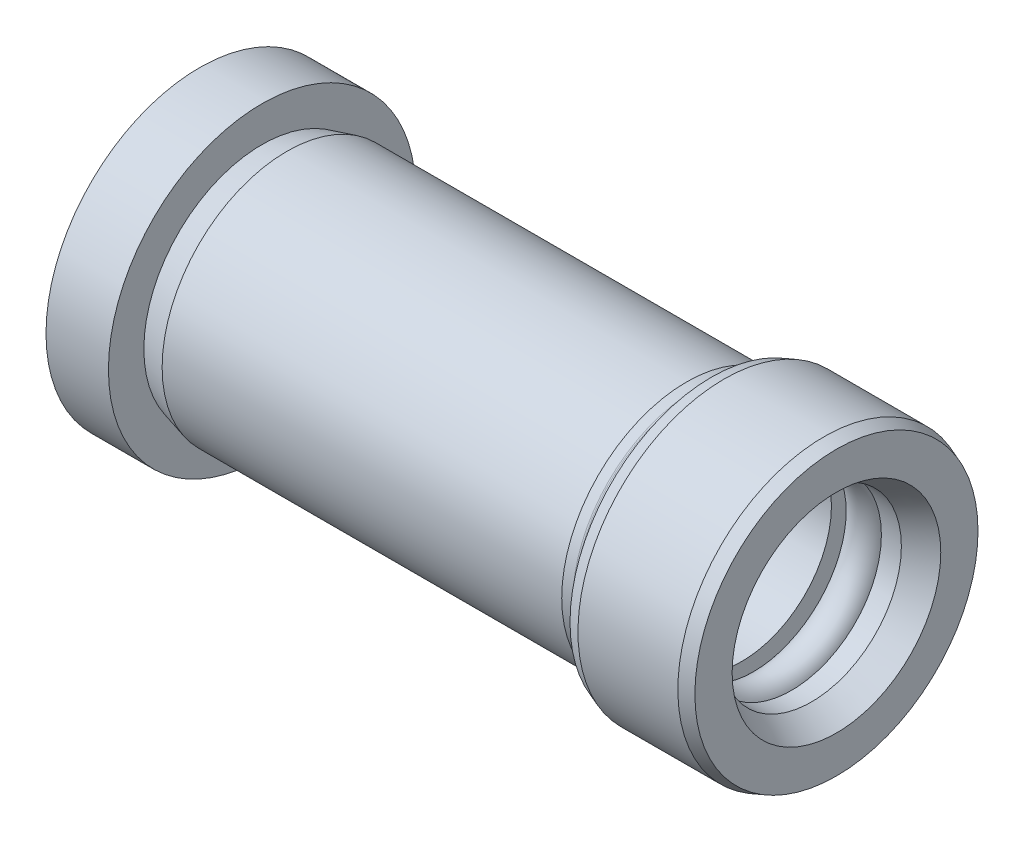
ISO-10303-21;
HEADER;
FILE_DESCRIPTION(('STEP AP214'),'2;1');
FILE_NAME('part.step','',(''),(''),'','','');
FILE_SCHEMA(('AUTOMOTIVE_DESIGN { 1 0 10303 214 1 1 1 1 }'));
ENDSEC;
DATA;
#1=APPLICATION_CONTEXT('core data for automotive mechanical design processes');
#2=APPLICATION_PROTOCOL_DEFINITION('international standard','automotive_design',2000,#1);
#3=PRODUCT_CONTEXT('',#1,'mechanical');
#4=PRODUCT('Part','Part','',(#3));
#5=PRODUCT_RELATED_PRODUCT_CATEGORY('part','',(#4));
#6=PRODUCT_DEFINITION_FORMATION('','',#4);
#7=PRODUCT_DEFINITION_CONTEXT('part definition',#1,'design');
#8=PRODUCT_DEFINITION('design','',#6,#7);
#9=PRODUCT_DEFINITION_SHAPE('','',#8);
#10=(LENGTH_UNIT() NAMED_UNIT(*) SI_UNIT(.MILLI.,.METRE.));
#11=(NAMED_UNIT(*) PLANE_ANGLE_UNIT() SI_UNIT($,.RADIAN.));
#12=(NAMED_UNIT(*) SI_UNIT($,.STERADIAN.) SOLID_ANGLE_UNIT());
#13=UNCERTAINTY_MEASURE_WITH_UNIT(LENGTH_MEASURE(1.E-05),#10,'distance_accuracy_value','');
#14=(GEOMETRIC_REPRESENTATION_CONTEXT(3) GLOBAL_UNCERTAINTY_ASSIGNED_CONTEXT((#13)) GLOBAL_UNIT_ASSIGNED_CONTEXT((#10,
#11,#12)) REPRESENTATION_CONTEXT('',''));
#15=CARTESIAN_POINT('',(0.,0.,0.));
#16=DIRECTION('',(0.,0.,1.));
#17=DIRECTION('',(1.,0.,0.));
#18=AXIS2_PLACEMENT_3D('',#15,#16,#17);
#19=CARTESIAN_POINT('',(90.4500000000326,0.,0.));
#20=DIRECTION('',(-1.,0.,0.));
#21=DIRECTION('',(0.,0.,1.));
#22=AXIS2_PLACEMENT_3D('',#19,#20,#21);
#23=CONICAL_SURFACE('',#22,3.70000000000914,0.2617993878087);
#24=CARTESIAN_POINT('',(90.45,0.,0.));
#25=DIRECTION('',(-1.,0.,0.));
#26=DIRECTION('',(0.,0.,1.));
#27=AXIS2_PLACEMENT_3D('',#24,#25,#26);
#28=CIRCLE('',#27,3.7);
#29=CARTESIAN_POINT('',(90.45,0.,3.7));
#30=VERTEX_POINT('',#29);
#31=EDGE_CURVE('P0_E29',#30,#30,#28,.T.);
#32=ORIENTED_EDGE('',*,*,#31,.F.);
#33=EDGE_LOOP('',(#32));
#34=FACE_BOUND('',#33,.T.);
#35=CARTESIAN_POINT('',(91.4499999999521,0.,0.));
#36=DIRECTION('',(-1.,0.,0.));
#37=DIRECTION('',(0.,0.,1.));
#38=AXIS2_PLACEMENT_3D('',#35,#36,#37);
#39=CIRCLE('',#38,3.43205080758935);
#40=CARTESIAN_POINT('',(91.4499999999521,0.,3.43205080758935));
#41=VERTEX_POINT('',#40);
#42=EDGE_CURVE('P0_E17',#41,#41,#39,.T.);
#43=ORIENTED_EDGE('',*,*,#42,.T.);
#44=EDGE_LOOP('',(#43));
#45=FACE_BOUND('',#44,.T.);
#46=ADVANCED_FACE('P0_F14',(#34,#45),#23,.T.);
#47=CARTESIAN_POINT('',(84.45,0.,0.));
#48=DIRECTION('',(-1.,0.,0.));
#49=DIRECTION('',(0.,0.,1.));
#50=AXIS2_PLACEMENT_3D('',#47,#48,#49);
#51=CYLINDRICAL_SURFACE('',#50,3.7);
#52=CARTESIAN_POINT('',(89.6499999999492,0.,0.));
#53=DIRECTION('',(1.,0.,0.));
#54=DIRECTION('',(0.,0.,-1.));
#55=AXIS2_PLACEMENT_3D('',#52,#53,#54);
#56=CIRCLE('',#55,3.69999999998072);
#57=CARTESIAN_POINT('',(89.6499999999492,0.,-3.69999999998072));
#58=VERTEX_POINT('',#57);
#59=EDGE_CURVE('P0_E41',#58,#58,#56,.F.);
#60=ORIENTED_EDGE('',*,*,#59,.F.);
#61=EDGE_LOOP('',(#60));
#62=FACE_BOUND('',#61,.T.);
#63=ORIENTED_EDGE('',*,*,#31,.T.);
#64=EDGE_LOOP('',(#63));
#65=FACE_BOUND('',#64,.T.);
#66=ADVANCED_FACE('P0_F95',(#62,#65),#51,.T.);
#67=CARTESIAN_POINT('',(91.45,3.07735026918963,0.));
#68=DIRECTION('',(-1.,0.,0.));
#69=DIRECTION('',(0.,0.,1.));
#70=AXIS2_PLACEMENT_3D('',#67,#68,#69);
#71=PLANE('',#70);
#72=CARTESIAN_POINT('',(91.4500000000089,0.,0.));
#73=DIRECTION('',(1.,0.,0.));
#74=DIRECTION('',(0.,0.,-1.));
#75=AXIS2_PLACEMENT_3D('',#72,#73,#74);
#76=CIRCLE('',#75,3.07735026924032);
#77=CARTESIAN_POINT('',(91.4500000000089,0.,-3.07735026924032));
#78=VERTEX_POINT('',#77);
#79=EDGE_CURVE('P0_E38',#78,#78,#76,.F.);
#80=ORIENTED_EDGE('',*,*,#79,.T.);
#81=EDGE_LOOP('',(#80));
#82=FACE_BOUND('',#81,.T.);
#83=ORIENTED_EDGE('',*,*,#42,.F.);
#84=EDGE_LOOP('',(#83));
#85=FACE_BOUND('',#84,.T.);
#86=ADVANCED_FACE('P0_F93',(#82,#85),#71,.F.);
#87=CARTESIAN_POINT('',(89.6499999997218,0.,0.));
#88=DIRECTION('',(1.,0.,0.));
#89=DIRECTION('',(0.,0.,-1.));
#90=AXIS2_PLACEMENT_3D('',#87,#88,#89);
#91=CONICAL_SURFACE('',#90,3.69999999989545,0.349065850379437);
#92=ORIENTED_EDGE('',*,*,#59,.T.);
#93=EDGE_LOOP('',(#92));
#94=FACE_BOUND('',#93,.T.);
#95=CARTESIAN_POINT('',(89.4439391935409,0.,0.));
#96=DIRECTION('',(-1.,0.,0.));
#97=DIRECTION('',(0.,0.,1.));
#98=AXIS2_PLACEMENT_3D('',#95,#96,#97);
#99=CIRCLE('',#98,3.625);
#100=CARTESIAN_POINT('',(89.4439391935409,0.,3.625));
#101=VERTEX_POINT('',#100);
#102=EDGE_CURVE('P0_E40',#101,#101,#99,.T.);
#103=ORIENTED_EDGE('',*,*,#102,.F.);
#104=EDGE_LOOP('',(#103));
#105=FACE_BOUND('',#104,.T.);
#106=ADVANCED_FACE('P0_F89',(#94,#105),#91,.T.);
#107=CARTESIAN_POINT('',(91.4499999997815,0.,0.));
#108=DIRECTION('',(1.,0.,0.));
#109=DIRECTION('',(0.,0.,-1.));
#110=AXIS2_PLACEMENT_3D('',#107,#108,#109);
#111=CONICAL_SURFACE('',#110,3.07735026910905,0.523598775592442);
#112=CARTESIAN_POINT('',(90.45,0.,0.));
#113=DIRECTION('',(-1.,0.,0.));
#114=DIRECTION('',(0.,0.,1.));
#115=AXIS2_PLACEMENT_3D('',#112,#113,#114);
#116=CIRCLE('',#115,2.5);
#117=CARTESIAN_POINT('',(90.45,0.,2.5));
#118=VERTEX_POINT('',#117);
#119=EDGE_CURVE('P0_E37',#118,#118,#116,.T.);
#120=ORIENTED_EDGE('',*,*,#119,.T.);
#121=EDGE_LOOP('',(#120));
#122=FACE_BOUND('',#121,.T.);
#123=ORIENTED_EDGE('',*,*,#79,.F.);
#124=EDGE_LOOP('',(#123));
#125=FACE_BOUND('',#124,.T.);
#126=ADVANCED_FACE('P0_F85',(#122,#125),#111,.F.);
#127=CARTESIAN_POINT('',(84.45,0.,0.));
#128=DIRECTION('',(-1.,0.,0.));
#129=DIRECTION('',(0.,0.,1.));
#130=AXIS2_PLACEMENT_3D('',#127,#128,#129);
#131=CYLINDRICAL_SURFACE('',#130,3.625);
#132=CARTESIAN_POINT('',(86.95,0.,0.));
#133=DIRECTION('',(-1.,0.,0.));
#134=DIRECTION('',(0.,0.,1.));
#135=AXIS2_PLACEMENT_3D('',#132,#133,#134);
#136=CIRCLE('',#135,3.625);
#137=CARTESIAN_POINT('',(86.95,0.,3.625));
#138=VERTEX_POINT('',#137);
#139=EDGE_CURVE('P0_E35',#138,#138,#136,.F.);
#140=ORIENTED_EDGE('',*,*,#139,.T.);
#141=EDGE_LOOP('',(#140));
#142=FACE_BOUND('',#141,.T.);
#143=ORIENTED_EDGE('',*,*,#102,.T.);
#144=EDGE_LOOP('',(#143));
#145=FACE_BOUND('',#144,.T.);
#146=ADVANCED_FACE('P0_F81',(#142,#145),#131,.T.);
#147=CARTESIAN_POINT('',(84.45,0.,0.));
#148=DIRECTION('',(-1.,0.,0.));
#149=DIRECTION('',(0.,0.,1.));
#150=AXIS2_PLACEMENT_3D('',#147,#148,#149);
#151=CYLINDRICAL_SURFACE('',#150,2.5);
#152=ORIENTED_EDGE('',*,*,#119,.F.);
#153=EDGE_LOOP('',(#152));
#154=FACE_BOUND('',#153,.T.);
#155=CARTESIAN_POINT('',(85.4500000000371,0.,0.));
#156=DIRECTION('',(-1.,0.,0.));
#157=DIRECTION('',(0.,0.,1.));
#158=AXIS2_PLACEMENT_3D('',#155,#156,#157);
#159=CIRCLE('',#158,2.49999999994088);
#160=CARTESIAN_POINT('',(85.4500000000371,0.,2.49999999994088));
#161=VERTEX_POINT('',#160);
#162=EDGE_CURVE('P0_E34',#161,#161,#159,.T.);
#163=ORIENTED_EDGE('',*,*,#162,.T.);
#164=EDGE_LOOP('',(#163));
#165=FACE_BOUND('',#164,.T.);
#166=ADVANCED_FACE('P0_F56',(#154,#165),#151,.F.);
#167=CARTESIAN_POINT('',(86.95,3.625,0.));
#168=DIRECTION('',(-1.,0.,0.));
#169=DIRECTION('',(0.,0.,1.));
#170=AXIS2_PLACEMENT_3D('',#167,#168,#169);
#171=PLANE('',#170);
#172=ORIENTED_EDGE('',*,*,#139,.F.);
#173=EDGE_LOOP('',(#172));
#174=FACE_BOUND('',#173,.T.);
#175=CARTESIAN_POINT('',(86.95,0.,0.));
#176=DIRECTION('',(-1.,0.,0.));
#177=DIRECTION('',(0.,0.,1.));
#178=AXIS2_PLACEMENT_3D('',#175,#176,#177);
#179=CIRCLE('',#178,6.15);
#180=CARTESIAN_POINT('',(86.95,0.,6.15));
#181=VERTEX_POINT('',#180);
#182=EDGE_CURVE('P0_E26',#181,#181,#179,.T.);
#183=ORIENTED_EDGE('',*,*,#182,.F.);
#184=EDGE_LOOP('',(#183));
#185=FACE_BOUND('',#184,.T.);
#186=ADVANCED_FACE('P0_F62',(#174,#185),#171,.F.);
#187=CARTESIAN_POINT('',(84.4500000000039,0.,0.));
#188=DIRECTION('',(-1.,0.,0.));
#189=DIRECTION('',(0.,0.,1.));
#190=AXIS2_PLACEMENT_3D('',#187,#188,#189);
#191=CONICAL_SURFACE('',#190,3.07735026916589,0.523598775610461);
#192=ORIENTED_EDGE('',*,*,#162,.F.);
#193=EDGE_LOOP('',(#192));
#194=FACE_BOUND('',#193,.T.);
#195=CARTESIAN_POINT('',(84.4500000000039,0.,0.));
#196=DIRECTION('',(-1.,0.,0.));
#197=DIRECTION('',(0.,0.,1.));
#198=AXIS2_PLACEMENT_3D('',#195,#196,#197);
#199=CIRCLE('',#198,3.07735026916589);
#200=CARTESIAN_POINT('',(84.4500000000039,0.,3.07735026916589));
#201=VERTEX_POINT('',#200);
#202=EDGE_CURVE('P0_E21',#201,#201,#199,.T.);
#203=ORIENTED_EDGE('',*,*,#202,.T.);
#204=EDGE_LOOP('',(#203));
#205=FACE_BOUND('',#204,.T.);
#206=ADVANCED_FACE('P0_F58',(#194,#205),#191,.F.);
#207=CARTESIAN_POINT('',(84.45,0.,0.));
#208=DIRECTION('',(-1.,0.,0.));
#209=DIRECTION('',(0.,0.,1.));
#210=AXIS2_PLACEMENT_3D('',#207,#208,#209);
#211=CYLINDRICAL_SURFACE('',#210,6.15);
#212=CARTESIAN_POINT('',(84.45,0.,0.));
#213=DIRECTION('',(-1.,0.,0.));
#214=DIRECTION('',(0.,0.,1.));
#215=AXIS2_PLACEMENT_3D('',#212,#213,#214);
#216=CIRCLE('',#215,6.15);
#217=CARTESIAN_POINT('',(84.45,0.,6.15));
#218=VERTEX_POINT('',#217);
#219=EDGE_CURVE('P0_E10',#218,#218,#216,.F.);
#220=ORIENTED_EDGE('',*,*,#219,.T.);
#221=EDGE_LOOP('',(#220));
#222=FACE_BOUND('',#221,.T.);
#223=ORIENTED_EDGE('',*,*,#182,.T.);
#224=EDGE_LOOP('',(#223));
#225=FACE_BOUND('',#224,.T.);
#226=ADVANCED_FACE('P0_F61',(#222,#225),#211,.T.);
#227=CARTESIAN_POINT('',(84.45,6.15,0.));
#228=DIRECTION('',(1.,0.,0.));
#229=DIRECTION('',(0.,0.,-1.));
#230=AXIS2_PLACEMENT_3D('',#227,#228,#229);
#231=PLANE('',#230);
#232=ORIENTED_EDGE('',*,*,#219,.F.);
#233=EDGE_LOOP('',(#232));
#234=FACE_BOUND('',#233,.T.);
#235=ORIENTED_EDGE('',*,*,#202,.F.);
#236=EDGE_LOOP('',(#235));
#237=FACE_BOUND('',#236,.T.);
#238=ADVANCED_FACE('P0_F66',(#234,#237),#231,.F.);
#239=CLOSED_SHELL('',(#46,#66,#86,#106,#126,#146,#166,#186,#206,#226,#238));
#240=MANIFOLD_SOLID_BREP('P0_B1',#239);
#241=CARTESIAN_POINT('',(107.85,0.,0.));
#242=DIRECTION('',(-1.,0.,0.));
#243=DIRECTION('',(0.,0.,1.));
#244=AXIS2_PLACEMENT_3D('',#241,#242,#243);
#245=TOROIDAL_SURFACE('',#244,4.425,0.3);
#246=CARTESIAN_POINT('',(108.15,0.,0.));
#247=DIRECTION('',(1.,0.,0.));
#248=DIRECTION('',(0.,0.,-1.));
#249=AXIS2_PLACEMENT_3D('',#246,#247,#248);
#250=CIRCLE('',#249,4.425);
#251=CARTESIAN_POINT('',(108.15,0.,-4.425));
#252=VERTEX_POINT('',#251);
#253=CARTESIAN_POINT('',(108.15,0.,4.425));
#254=VERTEX_POINT('',#253);
#255=EDGE_CURVE('P1_E53',#252,#254,#250,.T.);
#256=ORIENTED_EDGE('',*,*,#255,.T.);
#257=CARTESIAN_POINT('',(108.15,0.,0.));
#258=DIRECTION('',(1.,0.,0.));
#259=DIRECTION('',(0.,0.,1.));
#260=AXIS2_PLACEMENT_3D('',#257,#258,#259);
#261=CIRCLE('',#260,4.425);
#262=EDGE_CURVE('P1_E51',#254,#252,#261,.T.);
#263=ORIENTED_EDGE('',*,*,#262,.T.);
#264=EDGE_LOOP('',(#256,#263));
#265=FACE_BOUND('',#264,.T.);
#266=CARTESIAN_POINT('',(107.85,0.,0.));
#267=DIRECTION('',(-1.,0.,0.));
#268=DIRECTION('',(0.,0.,1.));
#269=AXIS2_PLACEMENT_3D('',#266,#267,#268);
#270=CIRCLE('',#269,4.725);
#271=CARTESIAN_POINT('',(107.85,0.,4.725));
#272=VERTEX_POINT('',#271);
#273=EDGE_CURVE('P1_E58',#272,#272,#270,.T.);
#274=ORIENTED_EDGE('',*,*,#273,.T.);
#275=EDGE_LOOP('',(#274));
#276=FACE_BOUND('',#275,.T.);
#277=ADVANCED_FACE('P1_F16',(#265,#276),#245,.F.);
#278=CARTESIAN_POINT('',(108.15,3.6,0.));
#279=DIRECTION('',(1.,0.,0.));
#280=DIRECTION('',(0.,0.,-1.));
#281=AXIS2_PLACEMENT_3D('',#278,#279,#280);
#282=PLANE('',#281);
#283=ORIENTED_EDGE('',*,*,#262,.F.);
#284=ORIENTED_EDGE('',*,*,#255,.F.);
#285=EDGE_LOOP('',(#283,#284));
#286=FACE_BOUND('',#285,.T.);
#287=CARTESIAN_POINT('',(108.15,0.,0.));
#288=DIRECTION('',(1.,0.,0.));
#289=DIRECTION('',(0.,0.,-1.));
#290=AXIS2_PLACEMENT_3D('',#287,#288,#289);
#291=CIRCLE('',#290,3.6);
#292=CARTESIAN_POINT('',(108.15,0.,-3.6));
#293=VERTEX_POINT('',#292);
#294=EDGE_CURVE('P1_E90',#293,#293,#291,.T.);
#295=ORIENTED_EDGE('',*,*,#294,.T.);
#296=EDGE_LOOP('',(#295));
#297=FACE_BOUND('',#296,.T.);
#298=ADVANCED_FACE('P1_F61',(#286,#297),#282,.F.);
#299=CARTESIAN_POINT('',(101.8579108662,0.,0.));
#300=DIRECTION('',(-1.,0.,0.));
#301=DIRECTION('',(0.,0.,1.));
#302=AXIS2_PLACEMENT_3D('',#299,#300,#301);
#303=CYLINDRICAL_SURFACE('',#302,4.725);
#304=ORIENTED_EDGE('',*,*,#273,.F.);
#305=EDGE_LOOP('',(#304));
#306=FACE_BOUND('',#305,.T.);
#307=CARTESIAN_POINT('',(106.45,0.,0.));
#308=DIRECTION('',(-1.,0.,0.));
#309=DIRECTION('',(0.,0.,1.));
#310=AXIS2_PLACEMENT_3D('',#307,#308,#309);
#311=CIRCLE('',#310,4.725);
#312=CARTESIAN_POINT('',(106.45,0.,4.725));
#313=VERTEX_POINT('',#312);
#314=EDGE_CURVE('P1_E65',#313,#313,#311,.T.);
#315=ORIENTED_EDGE('',*,*,#314,.T.);
#316=EDGE_LOOP('',(#315));
#317=FACE_BOUND('',#316,.T.);
#318=ADVANCED_FACE('P1_F78',(#306,#317),#303,.F.);
#319=CARTESIAN_POINT('',(109.95,0.,0.));
#320=DIRECTION('',(1.,0.,0.));
#321=DIRECTION('',(0.,0.,-1.));
#322=AXIS2_PLACEMENT_3D('',#319,#320,#321);
#323=CYLINDRICAL_SURFACE('',#322,3.6);
#324=ORIENTED_EDGE('',*,*,#294,.F.);
#325=EDGE_LOOP('',(#324));
#326=FACE_BOUND('',#325,.T.);
#327=CARTESIAN_POINT('',(108.95000000005,0.,0.));
#328=DIRECTION('',(1.,0.,0.));
#329=DIRECTION('',(0.,0.,-1.));
#330=AXIS2_PLACEMENT_3D('',#327,#328,#329);
#331=CIRCLE('',#330,3.60000000000582);
#332=CARTESIAN_POINT('',(108.95000000005,0.,-3.60000000000582));
#333=VERTEX_POINT('',#332);
#334=EDGE_CURVE('P1_E97',#333,#333,#331,.T.);
#335=ORIENTED_EDGE('',*,*,#334,.T.);
#336=EDGE_LOOP('',(#335));
#337=FACE_BOUND('',#336,.T.);
#338=ADVANCED_FACE('P1_F229',(#326,#337),#323,.F.);
#339=CARTESIAN_POINT('',(106.45,0.,0.));
#340=DIRECTION('',(-1.,0.,0.));
#341=DIRECTION('',(0.,0.,1.));
#342=AXIS2_PLACEMENT_3D('',#339,#340,#341);
#343=TOROIDAL_SURFACE('',#342,4.425,0.3);
#344=ORIENTED_EDGE('',*,*,#314,.F.);
#345=EDGE_LOOP('',(#344));
#346=FACE_BOUND('',#345,.T.);
#347=CARTESIAN_POINT('',(106.15,0.,0.));
#348=DIRECTION('',(-1.,0.,0.));
#349=DIRECTION('',(0.,0.,-1.));
#350=AXIS2_PLACEMENT_3D('',#347,#348,#349);
#351=CIRCLE('',#350,4.425);
#352=CARTESIAN_POINT('',(106.15,0.,-4.425));
#353=VERTEX_POINT('',#352);
#354=CARTESIAN_POINT('',(106.15,0.,4.425));
#355=VERTEX_POINT('',#354);
#356=EDGE_CURVE('P1_E193',#353,#355,#351,.T.);
#357=ORIENTED_EDGE('',*,*,#356,.T.);
#358=CARTESIAN_POINT('',(106.15,0.,0.));
#359=DIRECTION('',(-1.,0.,0.));
#360=DIRECTION('',(0.,0.,1.));
#361=AXIS2_PLACEMENT_3D('',#358,#359,#360);
#362=CIRCLE('',#361,4.425);
#363=EDGE_CURVE('P1_E249',#355,#353,#362,.T.);
#364=ORIENTED_EDGE('',*,*,#363,.T.);
#365=EDGE_LOOP('',(#357,#364));
#366=FACE_BOUND('',#365,.T.);
#367=ADVANCED_FACE('P1_F226',(#346,#366),#343,.F.);
#368=CARTESIAN_POINT('',(109.949999999969,0.,0.));
#369=DIRECTION('',(1.,0.,0.));
#370=DIRECTION('',(0.,0.,-1.));
#371=AXIS2_PLACEMENT_3D('',#368,#369,#370);
#372=CONICAL_SURFACE('',#371,4.17735026917398,0.523598775617056);
#373=ORIENTED_EDGE('',*,*,#334,.F.);
#374=EDGE_LOOP('',(#373));
#375=FACE_BOUND('',#374,.T.);
#376=CARTESIAN_POINT('',(109.949999999969,0.,0.));
#377=DIRECTION('',(1.,0.,0.));
#378=DIRECTION('',(0.,0.,-1.));
#379=AXIS2_PLACEMENT_3D('',#376,#377,#378);
#380=CIRCLE('',#379,4.17735026917398);
#381=CARTESIAN_POINT('',(109.949999999969,0.,-4.17735026917398));
#382=VERTEX_POINT('',#381);
#383=EDGE_CURVE('P1_E100',#382,#382,#380,.T.);
#384=ORIENTED_EDGE('',*,*,#383,.T.);
#385=EDGE_LOOP('',(#384));
#386=FACE_BOUND('',#385,.T.);
#387=ADVANCED_FACE('P1_F210',(#375,#386),#372,.F.);
#388=CARTESIAN_POINT('',(106.15,4.425,0.));
#389=DIRECTION('',(-1.,0.,0.));
#390=DIRECTION('',(0.,0.,1.));
#391=AXIS2_PLACEMENT_3D('',#388,#389,#390);
#392=PLANE('',#391);
#393=CARTESIAN_POINT('',(106.15,0.,0.));
#394=DIRECTION('',(1.,0.,0.));
#395=DIRECTION('',(0.,0.,-1.));
#396=AXIS2_PLACEMENT_3D('',#393,#394,#395);
#397=CIRCLE('',#396,3.6);
#398=CARTESIAN_POINT('',(106.15,0.,-3.6));
#399=VERTEX_POINT('',#398);
#400=EDGE_CURVE('P1_E252',#399,#399,#397,.F.);
#401=ORIENTED_EDGE('',*,*,#400,.T.);
#402=EDGE_LOOP('',(#401));
#403=FACE_BOUND('',#402,.T.);
#404=ORIENTED_EDGE('',*,*,#356,.F.);
#405=ORIENTED_EDGE('',*,*,#363,.F.);
#406=EDGE_LOOP('',(#404,#405));
#407=FACE_BOUND('',#406,.T.);
#408=ADVANCED_FACE('P1_F199',(#403,#407),#392,.F.);
#409=CARTESIAN_POINT('',(109.95,5.6680148828669,0.));
#410=DIRECTION('',(-1.,0.,0.));
#411=DIRECTION('',(0.,0.,1.));
#412=AXIS2_PLACEMENT_3D('',#409,#410,#411);
#413=PLANE('',#412);
#414=CARTESIAN_POINT('',(109.950000000026,0.,0.));
#415=DIRECTION('',(-1.,0.,0.));
#416=DIRECTION('',(0.,-1.,0.));
#417=AXIS2_PLACEMENT_3D('',#414,#415,#416);
#418=CIRCLE('',#417,5.66801488286932);
#419=CARTESIAN_POINT('',(109.950000000026,-5.66801488286932,0.));
#420=VERTEX_POINT('',#419);
#421=EDGE_CURVE('P1_E256',#420,#420,#418,.T.);
#422=ORIENTED_EDGE('',*,*,#421,.F.);
#423=EDGE_LOOP('',(#422));
#424=FACE_BOUND('',#423,.T.);
#425=ORIENTED_EDGE('',*,*,#383,.F.);
#426=EDGE_LOOP('',(#425));
#427=FACE_BOUND('',#426,.T.);
#428=ADVANCED_FACE('P1_F209',(#424,#427),#413,.F.);
#429=CARTESIAN_POINT('',(109.95,0.,0.));
#430=DIRECTION('',(1.,0.,0.));
#431=DIRECTION('',(0.,0.,-1.));
#432=AXIS2_PLACEMENT_3D('',#429,#430,#431);
#433=CYLINDRICAL_SURFACE('',#432,3.6);
#434=CARTESIAN_POINT('',(90.95,0.,0.));
#435=DIRECTION('',(1.,0.,0.));
#436=DIRECTION('',(0.,0.,-1.));
#437=AXIS2_PLACEMENT_3D('',#434,#435,#436);
#438=CIRCLE('',#437,3.6);
#439=CARTESIAN_POINT('',(90.95,0.,-3.6));
#440=VERTEX_POINT('',#439);
#441=EDGE_CURVE('P1_E188',#440,#440,#438,.F.);
#442=ORIENTED_EDGE('',*,*,#441,.T.);
#443=EDGE_LOOP('',(#442));
#444=FACE_BOUND('',#443,.T.);
#445=ORIENTED_EDGE('',*,*,#400,.F.);
#446=EDGE_LOOP('',(#445));
#447=FACE_BOUND('',#446,.T.);
#448=ADVANCED_FACE('P1_F366',(#444,#447),#433,.F.);
#449=CARTESIAN_POINT('',(109.450000000152,0.,0.));
#450=DIRECTION('',(-1.,0.,0.));
#451=DIRECTION('',(0.,-1.,0.));
#452=AXIS2_PLACEMENT_3D('',#449,#450,#451);
#453=CONICAL_SURFACE('',#452,5.84999999995262,0.349065850391579);
#454=CARTESIAN_POINT('',(109.45,0.,0.));
#455=DIRECTION('',(1.,0.,0.));
#456=DIRECTION('',(0.,0.,-1.));
#457=AXIS2_PLACEMENT_3D('',#454,#455,#456);
#458=CIRCLE('',#457,5.85);
#459=CARTESIAN_POINT('',(109.45,0.,-5.85));
#460=VERTEX_POINT('',#459);
#461=EDGE_CURVE('P1_E185',#460,#460,#458,.F.);
#462=ORIENTED_EDGE('',*,*,#461,.F.);
#463=EDGE_LOOP('',(#462));
#464=FACE_BOUND('',#463,.T.);
#465=ORIENTED_EDGE('',*,*,#421,.T.);
#466=EDGE_LOOP('',(#465));
#467=FACE_BOUND('',#466,.T.);
#468=ADVANCED_FACE('P1_F363',(#464,#467),#453,.T.);
#469=CARTESIAN_POINT('',(90.95,3.75,0.));
#470=DIRECTION('',(1.,0.,0.));
#471=DIRECTION('',(0.,0.,-1.));
#472=AXIS2_PLACEMENT_3D('',#469,#470,#471);
#473=PLANE('',#472);
#474=ORIENTED_EDGE('',*,*,#441,.F.);
#475=EDGE_LOOP('',(#474));
#476=FACE_BOUND('',#475,.T.);
#477=CARTESIAN_POINT('',(90.95,0.,0.));
#478=DIRECTION('',(1.,0.,0.));
#479=DIRECTION('',(0.,0.,-1.));
#480=AXIS2_PLACEMENT_3D('',#477,#478,#479);
#481=CIRCLE('',#480,3.75);
#482=CARTESIAN_POINT('',(90.95,0.,-3.75));
#483=VERTEX_POINT('',#482);
#484=EDGE_CURVE('P1_E184',#483,#483,#481,.F.);
#485=ORIENTED_EDGE('',*,*,#484,.T.);
#486=EDGE_LOOP('',(#485));
#487=FACE_BOUND('',#486,.T.);
#488=ADVANCED_FACE('P1_F356',(#476,#487),#473,.F.);
#489=CARTESIAN_POINT('',(109.95,0.,0.));
#490=DIRECTION('',(1.,0.,0.));
#491=DIRECTION('',(0.,0.,-1.));
#492=AXIS2_PLACEMENT_3D('',#489,#490,#491);
#493=CYLINDRICAL_SURFACE('',#492,5.85);
#494=ORIENTED_EDGE('',*,*,#461,.T.);
#495=EDGE_LOOP('',(#494));
#496=FACE_BOUND('',#495,.T.);
#497=CARTESIAN_POINT('',(105.450000000019,0.,0.));
#498=DIRECTION('',(1.,0.,0.));
#499=DIRECTION('',(0.,0.,-1.));
#500=AXIS2_PLACEMENT_3D('',#497,#498,#499);
#501=CIRCLE('',#500,5.85000000003788);
#502=CARTESIAN_POINT('',(105.450000000019,0.,-5.85000000003788));
#503=VERTEX_POINT('',#502);
#504=EDGE_CURVE('P1_E181',#503,#503,#501,.F.);
#505=ORIENTED_EDGE('',*,*,#504,.F.);
#506=EDGE_LOOP('',(#505));
#507=FACE_BOUND('',#506,.T.);
#508=ADVANCED_FACE('P1_F350',(#496,#507),#493,.T.);
#509=CARTESIAN_POINT('',(109.95,0.,0.));
#510=DIRECTION('',(1.,0.,0.));
#511=DIRECTION('',(0.,0.,-1.));
#512=AXIS2_PLACEMENT_3D('',#509,#510,#511);
#513=CYLINDRICAL_SURFACE('',#512,3.75);
#514=ORIENTED_EDGE('',*,*,#484,.F.);
#515=EDGE_LOOP('',(#514));
#516=FACE_BOUND('',#515,.T.);
#517=CARTESIAN_POINT('',(89.8621216128959,0.,0.));
#518=DIRECTION('',(1.,0.,0.));
#519=DIRECTION('',(0.,0.,-1.));
#520=AXIS2_PLACEMENT_3D('',#517,#518,#519);
#521=CIRCLE('',#520,3.74999999999659);
#522=CARTESIAN_POINT('',(89.8621216128959,0.,-3.74999999999659));
#523=VERTEX_POINT('',#522);
#524=EDGE_CURVE('P1_E177',#523,#523,#521,.F.);
#525=ORIENTED_EDGE('',*,*,#524,.T.);
#526=EDGE_LOOP('',(#525));
#527=FACE_BOUND('',#526,.T.);
#528=ADVANCED_FACE('P1_F345',(#516,#527),#513,.F.);
#529=CARTESIAN_POINT('',(105.450000000019,0.,0.));
#530=DIRECTION('',(1.,0.,0.));
#531=DIRECTION('',(0.,1.,0.));
#532=AXIS2_PLACEMENT_3D('',#529,#530,#531);
#533=CONICAL_SURFACE('',#532,5.85000000003788,0.349065850377923);
#534=ORIENTED_EDGE('',*,*,#504,.T.);
#535=EDGE_LOOP('',(#534));
#536=FACE_BOUND('',#535,.T.);
#537=CARTESIAN_POINT('',(104.949999999974,0.,0.));
#538=DIRECTION('',(1.,0.,0.));
#539=DIRECTION('',(0.,1.,0.));
#540=AXIS2_PLACEMENT_3D('',#537,#538,#539);
#541=CIRCLE('',#540,5.66801488290025);
#542=CARTESIAN_POINT('',(104.949999999974,5.66801488290025,0.));
#543=VERTEX_POINT('',#542);
#544=EDGE_CURVE('P1_E180',#543,#543,#541,.T.);
#545=ORIENTED_EDGE('',*,*,#544,.T.);
#546=EDGE_LOOP('',(#545));
#547=FACE_BOUND('',#546,.T.);
#548=ADVANCED_FACE('P1_F340',(#536,#547),#533,.T.);
#549=CARTESIAN_POINT('',(89.8621216126685,0.,0.));
#550=DIRECTION('',(1.,0.,0.));
#551=DIRECTION('',(0.,0.,-1.));
#552=AXIS2_PLACEMENT_3D('',#549,#550,#551);
#553=CONICAL_SURFACE('',#552,3.74999999991132,0.349065850335108);
#554=ORIENTED_EDGE('',*,*,#524,.F.);
#555=EDGE_LOOP('',(#554));
#556=FACE_BOUND('',#555,.T.);
#557=CARTESIAN_POINT('',(89.45,0.,0.));
#558=DIRECTION('',(1.,0.,0.));
#559=DIRECTION('',(0.,0.,-1.));
#560=AXIS2_PLACEMENT_3D('',#557,#558,#559);
#561=CIRCLE('',#560,3.6);
#562=CARTESIAN_POINT('',(89.45,0.,-3.6));
#563=VERTEX_POINT('',#562);
#564=EDGE_CURVE('P1_E174',#563,#563,#561,.F.);
#565=ORIENTED_EDGE('',*,*,#564,.T.);
#566=EDGE_LOOP('',(#565));
#567=FACE_BOUND('',#566,.T.);
#568=ADVANCED_FACE('P1_F149',(#556,#567),#553,.F.);
#569=CARTESIAN_POINT('',(104.95,5.6680148828669,0.));
#570=DIRECTION('',(1.,0.,0.));
#571=DIRECTION('',(0.,0.,-1.));
#572=AXIS2_PLACEMENT_3D('',#569,#570,#571);
#573=PLANE('',#572);
#574=ORIENTED_EDGE('',*,*,#544,.F.);
#575=EDGE_LOOP('',(#574));
#576=FACE_BOUND('',#575,.T.);
#577=CARTESIAN_POINT('',(104.95,0.,0.));
#578=DIRECTION('',(-1.,0.,0.));
#579=DIRECTION('',(0.,0.,-1.));
#580=AXIS2_PLACEMENT_3D('',#577,#578,#579);
#581=CIRCLE('',#580,5.1);
#582=CARTESIAN_POINT('',(104.95,0.,5.1));
#583=VERTEX_POINT('',#582);
#584=CARTESIAN_POINT('',(104.95,0.,-5.1));
#585=VERTEX_POINT('',#584);
#586=EDGE_CURVE('P1_E104',#583,#585,#581,.F.);
#587=ORIENTED_EDGE('',*,*,#586,.T.);
#588=CARTESIAN_POINT('',(104.95,0.,0.));
#589=DIRECTION('',(-1.,0.,0.));
#590=DIRECTION('',(0.,0.,1.));
#591=AXIS2_PLACEMENT_3D('',#588,#589,#590);
#592=CIRCLE('',#591,5.1);
#593=EDGE_CURVE('P1_E36',#585,#583,#592,.F.);
#594=ORIENTED_EDGE('',*,*,#593,.T.);
#595=EDGE_LOOP('',(#587,#594));
#596=FACE_BOUND('',#595,.T.);
#597=ADVANCED_FACE('P1_F140',(#576,#596),#573,.F.);
#598=CARTESIAN_POINT('',(109.95,0.,0.));
#599=DIRECTION('',(1.,0.,0.));
#600=DIRECTION('',(0.,0.,-1.));
#601=AXIS2_PLACEMENT_3D('',#598,#599,#600);
#602=CYLINDRICAL_SURFACE('',#601,3.6);
#603=ORIENTED_EDGE('',*,*,#564,.F.);
#604=EDGE_LOOP('',(#603));
#605=FACE_BOUND('',#604,.T.);
#606=CARTESIAN_POINT('',(87.4500000000467,0.,0.));
#607=DIRECTION('',(-1.,0.,0.));
#608=DIRECTION('',(0.,0.,1.));
#609=AXIS2_PLACEMENT_3D('',#606,#607,#608);
#610=CIRCLE('',#609,3.60000000000582);
#611=CARTESIAN_POINT('',(87.4500000000467,0.,3.60000000000582));
#612=VERTEX_POINT('',#611);
#613=EDGE_CURVE('P1_E132',#612,#612,#610,.T.);
#614=ORIENTED_EDGE('',*,*,#613,.T.);
#615=EDGE_LOOP('',(#614));
#616=FACE_BOUND('',#615,.T.);
#617=ADVANCED_FACE('P1_F122',(#605,#616),#602,.F.);
#618=CARTESIAN_POINT('',(104.75,0.,0.));
#619=DIRECTION('',(1.,0.,0.));
#620=DIRECTION('',(0.,0.,-1.));
#621=AXIS2_PLACEMENT_3D('',#618,#619,#620);
#622=TOROIDAL_SURFACE('',#621,5.1,0.2);
#623=ORIENTED_EDGE('',*,*,#593,.F.);
#624=ORIENTED_EDGE('',*,*,#586,.F.);
#625=EDGE_LOOP('',(#623,#624));
#626=FACE_BOUND('',#625,.T.);
#627=CARTESIAN_POINT('',(104.75,0.,0.));
#628=DIRECTION('',(1.,0.,0.));
#629=DIRECTION('',(0.,0.,-1.));
#630=AXIS2_PLACEMENT_3D('',#627,#628,#629);
#631=CIRCLE('',#630,4.9);
#632=CARTESIAN_POINT('',(104.75,0.,-4.9));
#633=VERTEX_POINT('',#632);
#634=EDGE_CURVE('P1_E135',#633,#633,#631,.F.);
#635=ORIENTED_EDGE('',*,*,#634,.F.);
#636=EDGE_LOOP('',(#635));
#637=FACE_BOUND('',#636,.T.);
#638=ADVANCED_FACE('P1_F110',(#626,#637),#622,.F.);
#639=CARTESIAN_POINT('',(86.9499999999448,0.,0.));
#640=DIRECTION('',(-1.,0.,0.));
#641=DIRECTION('',(0.,0.,1.));
#642=AXIS2_PLACEMENT_3D('',#639,#640,#641);
#643=CONICAL_SURFACE('',#642,3.88867513464675,0.523598775615289);
#644=CARTESIAN_POINT('',(86.9499999999448,0.,0.));
#645=DIRECTION('',(-1.,0.,0.));
#646=DIRECTION('',(0.,0.,1.));
#647=AXIS2_PLACEMENT_3D('',#644,#645,#646);
#648=CIRCLE('',#647,3.88867513464675);
#649=CARTESIAN_POINT('',(86.9499999999448,0.,3.88867513464675));
#650=VERTEX_POINT('',#649);
#651=EDGE_CURVE('P1_E171',#650,#650,#648,.T.);
#652=ORIENTED_EDGE('',*,*,#651,.T.);
#653=EDGE_LOOP('',(#652));
#654=FACE_BOUND('',#653,.T.);
#655=ORIENTED_EDGE('',*,*,#613,.F.);
#656=EDGE_LOOP('',(#655));
#657=FACE_BOUND('',#656,.T.);
#658=ADVANCED_FACE('P1_F121',(#654,#657),#643,.F.);
#659=CARTESIAN_POINT('',(103.95,0.,0.));
#660=DIRECTION('',(1.,0.,0.));
#661=DIRECTION('',(0.,0.,-1.));
#662=AXIS2_PLACEMENT_3D('',#659,#660,#661);
#663=CYLINDRICAL_SURFACE('',#662,4.9);
#664=ORIENTED_EDGE('',*,*,#634,.T.);
#665=EDGE_LOOP('',(#664));
#666=FACE_BOUND('',#665,.T.);
#667=CARTESIAN_POINT('',(104.349535580274,0.,0.));
#668=DIRECTION('',(1.,0.,0.));
#669=DIRECTION('',(0.,0.,-1.));
#670=AXIS2_PLACEMENT_3D('',#667,#668,#669);
#671=CIRCLE('',#670,4.9);
#672=CARTESIAN_POINT('',(104.349535580274,0.,-4.9));
#673=VERTEX_POINT('',#672);
#674=EDGE_CURVE('P1_E130',#673,#673,#671,.T.);
#675=ORIENTED_EDGE('',*,*,#674,.T.);
#676=EDGE_LOOP('',(#675));
#677=FACE_BOUND('',#676,.T.);
#678=ADVANCED_FACE('P1_F286',(#666,#677),#663,.T.);
#679=CARTESIAN_POINT('',(86.95,3.88867513459482,0.));
#680=DIRECTION('',(1.,0.,0.));
#681=DIRECTION('',(0.,0.,-1.));
#682=AXIS2_PLACEMENT_3D('',#679,#680,#681);
#683=PLANE('',#682);
#684=ORIENTED_EDGE('',*,*,#651,.F.);
#685=EDGE_LOOP('',(#684));
#686=FACE_BOUND('',#685,.T.);
#687=CARTESIAN_POINT('',(86.9500000000016,0.,0.));
#688=DIRECTION('',(1.,0.,0.));
#689=DIRECTION('',(0.,0.,-1.));
#690=AXIS2_PLACEMENT_3D('',#687,#688,#689);
#691=CIRCLE('',#690,4.73205080757566);
#692=CARTESIAN_POINT('',(86.9500000000016,0.,-4.73205080757566));
#693=VERTEX_POINT('',#692);
#694=EDGE_CURVE('P1_E269',#693,#693,#691,.T.);
#695=ORIENTED_EDGE('',*,*,#694,.F.);
#696=EDGE_LOOP('',(#695));
#697=FACE_BOUND('',#696,.T.);
#698=ADVANCED_FACE('P1_F292',(#686,#697),#683,.F.);
#699=CARTESIAN_POINT('',(104.349535580274,0.,0.));
#700=DIRECTION('',(1.,0.,0.));
#701=DIRECTION('',(0.,0.,-1.));
#702=AXIS2_PLACEMENT_3D('',#699,#700,#701);
#703=TOROIDAL_SURFACE('',#702,5.1,0.2);
#704=ORIENTED_EDGE('',*,*,#674,.F.);
#705=EDGE_LOOP('',(#704));
#706=FACE_BOUND('',#705,.T.);
#707=CARTESIAN_POINT('',(104.297771771201,0.,0.));
#708=DIRECTION('',(-1.,0.,0.));
#709=DIRECTION('',(0.,0.,1.));
#710=AXIS2_PLACEMENT_3D('',#707,#708,#709);
#711=CIRCLE('',#710,4.90681483475441);
#712=CARTESIAN_POINT('',(104.297771771201,0.,4.90681483475441));
#713=VERTEX_POINT('',#712);
#714=EDGE_CURVE('P1_E271',#713,#713,#711,.T.);
#715=ORIENTED_EDGE('',*,*,#714,.F.);
#716=EDGE_LOOP('',(#715));
#717=FACE_BOUND('',#716,.T.);
#718=ADVANCED_FACE('P1_F288',(#706,#717),#703,.F.);
#719=CARTESIAN_POINT('',(87.9500000000348,0.,0.));
#720=DIRECTION('',(1.,0.,0.));
#721=DIRECTION('',(0.,0.,-1.));
#722=AXIS2_PLACEMENT_3D('',#719,#720,#721);
#723=CONICAL_SURFACE('',#722,5.00000000002387,0.261799387806796);
#724=CARTESIAN_POINT('',(87.95,0.,0.));
#725=DIRECTION('',(1.,0.,0.));
#726=DIRECTION('',(0.,0.,-1.));
#727=AXIS2_PLACEMENT_3D('',#724,#725,#726);
#728=CIRCLE('',#727,5.);
#729=CARTESIAN_POINT('',(87.95,0.,-5.));
#730=VERTEX_POINT('',#729);
#731=EDGE_CURVE('P1_E28',#730,#730,#728,.T.);
#732=ORIENTED_EDGE('',*,*,#731,.F.);
#733=EDGE_LOOP('',(#732));
#734=FACE_BOUND('',#733,.T.);
#735=ORIENTED_EDGE('',*,*,#694,.T.);
#736=EDGE_LOOP('',(#735));
#737=FACE_BOUND('',#736,.T.);
#738=ADVANCED_FACE('P1_F291',(#734,#737),#723,.T.);
#739=CARTESIAN_POINT('',(103.950000000054,0.,0.));
#740=DIRECTION('',(-1.,0.,0.));
#741=DIRECTION('',(0.,-1.,0.));
#742=AXIS2_PLACEMENT_3D('',#739,#740,#741);
#743=CONICAL_SURFACE('',#742,4.99999999996703,0.261799387749815);
#744=CARTESIAN_POINT('',(103.95,0.,0.));
#745=DIRECTION('',(1.,0.,0.));
#746=DIRECTION('',(0.,0.,-1.));
#747=AXIS2_PLACEMENT_3D('',#744,#745,#746);
#748=CIRCLE('',#747,5.);
#749=CARTESIAN_POINT('',(103.95,0.,-5.));
#750=VERTEX_POINT('',#749);
#751=EDGE_CURVE('P1_E11',#750,#750,#748,.F.);
#752=ORIENTED_EDGE('',*,*,#751,.F.);
#753=EDGE_LOOP('',(#752));
#754=FACE_BOUND('',#753,.T.);
#755=ORIENTED_EDGE('',*,*,#714,.T.);
#756=EDGE_LOOP('',(#755));
#757=FACE_BOUND('',#756,.T.);
#758=ADVANCED_FACE('P1_F296',(#754,#757),#743,.T.);
#759=CARTESIAN_POINT('',(109.95,0.,0.));
#760=DIRECTION('',(1.,0.,0.));
#761=DIRECTION('',(0.,0.,-1.));
#762=AXIS2_PLACEMENT_3D('',#759,#760,#761);
#763=CYLINDRICAL_SURFACE('',#762,5.);
#764=ORIENTED_EDGE('',*,*,#751,.T.);
#765=EDGE_LOOP('',(#764));
#766=FACE_BOUND('',#765,.T.);
#767=ORIENTED_EDGE('',*,*,#731,.T.);
#768=EDGE_LOOP('',(#767));
#769=FACE_BOUND('',#768,.T.);
#770=ADVANCED_FACE('P1_F298',(#766,#769),#763,.T.);
#771=CLOSED_SHELL('',(#277,#298,#318,#338,#367,#387,#408,#428,#448,#468,#488,#508,#528,#548,
#568,#597,#617,#638,#658,#678,#698,#718,#738,#758,#770));
#772=MANIFOLD_SOLID_BREP('P1_B1',#771);
#773=CARTESIAN_POINT('',(107.15,0.,0.));
#774=DIRECTION('',(-1.,0.,0.));
#775=DIRECTION('',(0.,0.,1.));
#776=AXIS2_PLACEMENT_3D('',#773,#774,#775);
#777=TOROIDAL_SURFACE('',#776,4.25,0.75);
#778=ADVANCED_FACE('P2_F13',(),#777,.T.);
#779=CLOSED_SHELL('',(#778));
#780=MANIFOLD_SOLID_BREP('P2_B1',#779);
#781=ADVANCED_BREP_SHAPE_REPRESENTATION('',(#18,#240,#772,#780),#14);
#782=SHAPE_DEFINITION_REPRESENTATION(#9,#781);
ENDSEC;
END-ISO-10303-21;
